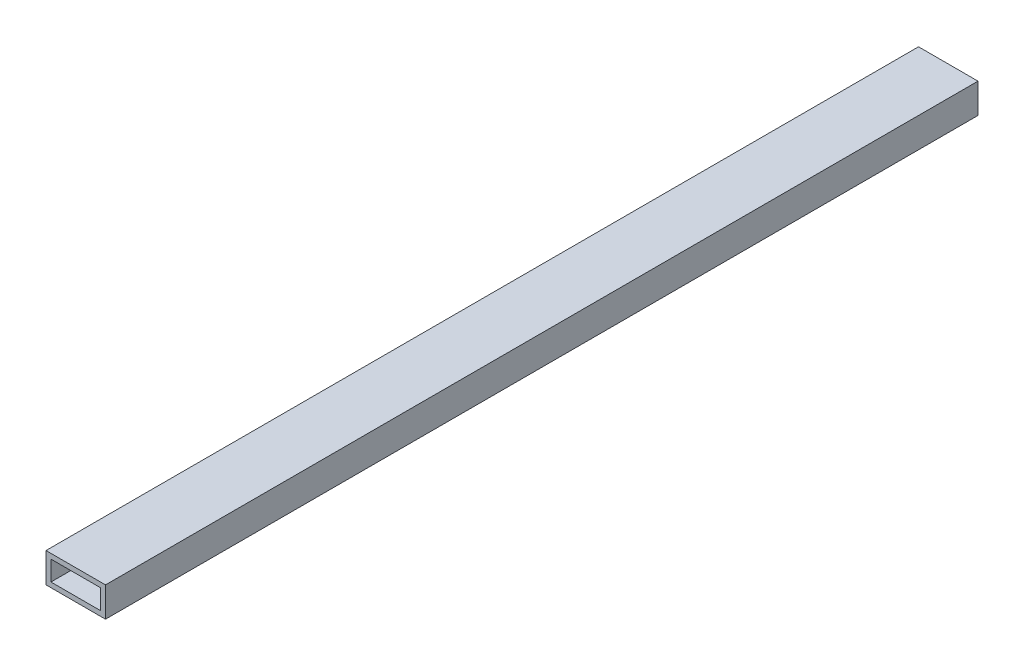
ISO-10303-21;
HEADER;
FILE_DESCRIPTION(('STEP AP214'),'2;1');
FILE_NAME('part.step','',(''),(''),'','','');
FILE_SCHEMA(('AUTOMOTIVE_DESIGN { 1 0 10303 214 1 1 1 1 }'));
ENDSEC;
DATA;
#1=APPLICATION_CONTEXT('core data for automotive mechanical design processes');
#2=APPLICATION_PROTOCOL_DEFINITION('international standard','automotive_design',2000,#1);
#3=PRODUCT_CONTEXT('',#1,'mechanical');
#4=PRODUCT('Part','Part','',(#3));
#5=PRODUCT_RELATED_PRODUCT_CATEGORY('part','',(#4));
#6=PRODUCT_DEFINITION_FORMATION('','',#4);
#7=PRODUCT_DEFINITION_CONTEXT('part definition',#1,'design');
#8=PRODUCT_DEFINITION('design','',#6,#7);
#9=PRODUCT_DEFINITION_SHAPE('','',#8);
#10=(LENGTH_UNIT() NAMED_UNIT(*) SI_UNIT(.MILLI.,.METRE.));
#11=(NAMED_UNIT(*) PLANE_ANGLE_UNIT() SI_UNIT($,.RADIAN.));
#12=(NAMED_UNIT(*) SI_UNIT($,.STERADIAN.) SOLID_ANGLE_UNIT());
#13=UNCERTAINTY_MEASURE_WITH_UNIT(LENGTH_MEASURE(1.E-05),#10,'distance_accuracy_value','');
#14=(GEOMETRIC_REPRESENTATION_CONTEXT(3) GLOBAL_UNCERTAINTY_ASSIGNED_CONTEXT((#13)) GLOBAL_UNIT_ASSIGNED_CONTEXT((#10,
#11,#12)) REPRESENTATION_CONTEXT('',''));
#15=CARTESIAN_POINT('',(0.,0.,0.));
#16=DIRECTION('',(0.,0.,1.));
#17=DIRECTION('',(1.,0.,0.));
#18=AXIS2_PLACEMENT_3D('',#15,#16,#17);
#19=CARTESIAN_POINT('',(0.,0.,558.8));
#20=DIRECTION('',(0.,0.,1.));
#21=DIRECTION('',(1.,0.,0.));
#22=AXIS2_PLACEMENT_3D('',#19,#20,#21);
#23=PLANE('',#22);
#24=DIRECTION('',(0.,-1.,0.));
#25=VECTOR('',#24,1.);
#26=CARTESIAN_POINT('',(0.,0.,558.8));
#27=LINE('',#26,#25);
#28=CARTESIAN_POINT('',(0.,19.05,558.8));
#29=VERTEX_POINT('',#28);
#30=CARTESIAN_POINT('',(0.,0.,558.8));
#31=VERTEX_POINT('',#30);
#32=EDGE_CURVE('E158',#29,#31,#27,.T.);
#33=ORIENTED_EDGE('',*,*,#32,.T.);
#34=DIRECTION('',(1.,0.,0.));
#35=VECTOR('',#34,1.);
#36=CARTESIAN_POINT('',(0.,0.,558.8));
#37=LINE('',#36,#35);
#38=CARTESIAN_POINT('',(38.1,0.,558.8));
#39=VERTEX_POINT('',#38);
#40=EDGE_CURVE('E161',#31,#39,#37,.T.);
#41=ORIENTED_EDGE('',*,*,#40,.T.);
#42=DIRECTION('',(0.,1.,0.));
#43=VECTOR('',#42,1.);
#44=CARTESIAN_POINT('',(38.1,0.,558.8));
#45=LINE('',#44,#43);
#46=CARTESIAN_POINT('',(38.1,19.05,558.8));
#47=VERTEX_POINT('',#46);
#48=EDGE_CURVE('E164',#39,#47,#45,.T.);
#49=ORIENTED_EDGE('',*,*,#48,.T.);
#50=DIRECTION('',(-1.,0.,0.));
#51=VECTOR('',#50,1.);
#52=CARTESIAN_POINT('',(0.,19.05,558.8));
#53=LINE('',#52,#51);
#54=EDGE_CURVE('E166',#47,#29,#53,.T.);
#55=ORIENTED_EDGE('',*,*,#54,.T.);
#56=EDGE_LOOP('',(#33,#41,#49,#55));
#57=FACE_BOUND('',#56,.T.);
#58=DIRECTION('',(1.,0.,0.));
#59=VECTOR('',#58,1.);
#60=CARTESIAN_POINT('',(0.,3.175,558.8));
#61=LINE('',#60,#59);
#62=CARTESIAN_POINT('',(3.175,3.175,558.8));
#63=VERTEX_POINT('',#62);
#64=CARTESIAN_POINT('',(34.925,3.175,558.8));
#65=VERTEX_POINT('',#64);
#66=EDGE_CURVE('E130',#63,#65,#61,.T.);
#67=ORIENTED_EDGE('',*,*,#66,.F.);
#68=DIRECTION('',(0.,-1.,0.));
#69=VECTOR('',#68,1.);
#70=CARTESIAN_POINT('',(3.175,0.,558.8));
#71=LINE('',#70,#69);
#72=CARTESIAN_POINT('',(3.175,15.875,558.8));
#73=VERTEX_POINT('',#72);
#74=EDGE_CURVE('E122',#73,#63,#71,.T.);
#75=ORIENTED_EDGE('',*,*,#74,.F.);
#76=DIRECTION('',(-1.,0.,0.));
#77=VECTOR('',#76,1.);
#78=CARTESIAN_POINT('',(0.,15.875,558.8));
#79=LINE('',#78,#77);
#80=CARTESIAN_POINT('',(34.925,15.875,558.8));
#81=VERTEX_POINT('',#80);
#82=EDGE_CURVE('E144',#81,#73,#79,.T.);
#83=ORIENTED_EDGE('',*,*,#82,.F.);
#84=DIRECTION('',(0.,1.,0.));
#85=VECTOR('',#84,1.);
#86=CARTESIAN_POINT('',(34.925,0.,558.8));
#87=LINE('',#86,#85);
#88=EDGE_CURVE('E142',#65,#81,#87,.T.);
#89=ORIENTED_EDGE('',*,*,#88,.F.);
#90=EDGE_LOOP('',(#67,#75,#83,#89));
#91=FACE_BOUND('',#90,.T.);
#92=ADVANCED_FACE('F57',(#57,#91),#23,.T.);
#93=CARTESIAN_POINT('',(0.,0.,0.));
#94=DIRECTION('',(0.,0.,1.));
#95=DIRECTION('',(1.,0.,0.));
#96=AXIS2_PLACEMENT_3D('',#93,#94,#95);
#97=PLANE('',#96);
#98=DIRECTION('',(0.,-1.,0.));
#99=VECTOR('',#98,1.);
#100=CARTESIAN_POINT('',(0.,0.,0.));
#101=LINE('',#100,#99);
#102=CARTESIAN_POINT('',(0.,19.05,0.));
#103=VERTEX_POINT('',#102);
#104=CARTESIAN_POINT('',(0.,0.,0.));
#105=VERTEX_POINT('',#104);
#106=EDGE_CURVE('E138',#103,#105,#101,.T.);
#107=ORIENTED_EDGE('',*,*,#106,.F.);
#108=DIRECTION('',(-1.,0.,0.));
#109=VECTOR('',#108,1.);
#110=CARTESIAN_POINT('',(0.,19.05,0.));
#111=LINE('',#110,#109);
#112=CARTESIAN_POINT('',(38.1,19.05,0.));
#113=VERTEX_POINT('',#112);
#114=EDGE_CURVE('E162',#113,#103,#111,.T.);
#115=ORIENTED_EDGE('',*,*,#114,.F.);
#116=DIRECTION('',(0.,1.,0.));
#117=VECTOR('',#116,1.);
#118=CARTESIAN_POINT('',(38.1,0.,0.));
#119=LINE('',#118,#117);
#120=CARTESIAN_POINT('',(38.1,0.,0.));
#121=VERTEX_POINT('',#120);
#122=EDGE_CURVE('E173',#121,#113,#119,.T.);
#123=ORIENTED_EDGE('',*,*,#122,.F.);
#124=DIRECTION('',(1.,0.,0.));
#125=VECTOR('',#124,1.);
#126=CARTESIAN_POINT('',(0.,0.,0.));
#127=LINE('',#126,#125);
#128=EDGE_CURVE('E171',#105,#121,#127,.T.);
#129=ORIENTED_EDGE('',*,*,#128,.F.);
#130=EDGE_LOOP('',(#107,#115,#123,#129));
#131=FACE_BOUND('',#130,.T.);
#132=DIRECTION('',(0.,-1.,0.));
#133=VECTOR('',#132,1.);
#134=CARTESIAN_POINT('',(3.175,0.,0.));
#135=LINE('',#134,#133);
#136=CARTESIAN_POINT('',(3.175,15.875,0.));
#137=VERTEX_POINT('',#136);
#138=CARTESIAN_POINT('',(3.175,3.175,0.));
#139=VERTEX_POINT('',#138);
#140=EDGE_CURVE('E80',#137,#139,#135,.T.);
#141=ORIENTED_EDGE('',*,*,#140,.T.);
#142=DIRECTION('',(1.,0.,0.));
#143=VECTOR('',#142,1.);
#144=CARTESIAN_POINT('',(0.,3.175,0.));
#145=LINE('',#144,#143);
#146=CARTESIAN_POINT('',(34.925,3.175,0.));
#147=VERTEX_POINT('',#146);
#148=EDGE_CURVE('E137',#139,#147,#145,.T.);
#149=ORIENTED_EDGE('',*,*,#148,.T.);
#150=DIRECTION('',(0.,1.,0.));
#151=VECTOR('',#150,1.);
#152=CARTESIAN_POINT('',(34.925,0.,0.));
#153=LINE('',#152,#151);
#154=CARTESIAN_POINT('',(34.925,15.875,0.));
#155=VERTEX_POINT('',#154);
#156=EDGE_CURVE('E150',#147,#155,#153,.T.);
#157=ORIENTED_EDGE('',*,*,#156,.T.);
#158=DIRECTION('',(-1.,0.,0.));
#159=VECTOR('',#158,1.);
#160=CARTESIAN_POINT('',(0.,15.875,0.));
#161=LINE('',#160,#159);
#162=EDGE_CURVE('E131',#155,#137,#161,.T.);
#163=ORIENTED_EDGE('',*,*,#162,.T.);
#164=EDGE_LOOP('',(#141,#149,#157,#163));
#165=FACE_BOUND('',#164,.T.);
#166=ADVANCED_FACE('F191',(#131,#165),#97,.F.);
#167=CARTESIAN_POINT('',(0.,0.,558.8));
#168=DIRECTION('',(1.,0.,0.));
#169=DIRECTION('',(0.,0.,-1.));
#170=AXIS2_PLACEMENT_3D('',#167,#168,#169);
#171=PLANE('',#170);
#172=ORIENTED_EDGE('',*,*,#106,.T.);
#173=DIRECTION('',(0.,0.,-1.));
#174=VECTOR('',#173,1.);
#175=CARTESIAN_POINT('',(0.,0.,558.8));
#176=LINE('',#175,#174);
#177=EDGE_CURVE('E12',#31,#105,#176,.T.);
#178=ORIENTED_EDGE('',*,*,#177,.F.);
#179=ORIENTED_EDGE('',*,*,#32,.F.);
#180=DIRECTION('',(0.,0.,-1.));
#181=VECTOR('',#180,1.);
#182=CARTESIAN_POINT('',(0.,19.05,558.8));
#183=LINE('',#182,#181);
#184=EDGE_CURVE('E168',#29,#103,#183,.T.);
#185=ORIENTED_EDGE('',*,*,#184,.T.);
#186=EDGE_LOOP('',(#172,#178,#179,#185));
#187=FACE_BOUND('',#186,.T.);
#188=ADVANCED_FACE('F59',(#187),#171,.F.);
#189=CARTESIAN_POINT('',(0.,0.,558.8));
#190=DIRECTION('',(0.,1.,0.));
#191=DIRECTION('',(0.,0.,1.));
#192=AXIS2_PLACEMENT_3D('',#189,#190,#191);
#193=PLANE('',#192);
#194=ORIENTED_EDGE('',*,*,#128,.T.);
#195=DIRECTION('',(0.,0.,-1.));
#196=VECTOR('',#195,1.);
#197=CARTESIAN_POINT('',(38.1,0.,558.8));
#198=LINE('',#197,#196);
#199=EDGE_CURVE('E65',#39,#121,#198,.T.);
#200=ORIENTED_EDGE('',*,*,#199,.F.);
#201=ORIENTED_EDGE('',*,*,#40,.F.);
#202=ORIENTED_EDGE('',*,*,#177,.T.);
#203=EDGE_LOOP('',(#194,#200,#201,#202));
#204=FACE_BOUND('',#203,.T.);
#205=ADVANCED_FACE('F201',(#204),#193,.F.);
#206=CARTESIAN_POINT('',(38.1,0.,558.8));
#207=DIRECTION('',(-1.,0.,0.));
#208=DIRECTION('',(0.,0.,1.));
#209=AXIS2_PLACEMENT_3D('',#206,#207,#208);
#210=PLANE('',#209);
#211=ORIENTED_EDGE('',*,*,#122,.T.);
#212=DIRECTION('',(0.,0.,-1.));
#213=VECTOR('',#212,1.);
#214=CARTESIAN_POINT('',(38.1,19.05,558.8));
#215=LINE('',#214,#213);
#216=EDGE_CURVE('E178',#47,#113,#215,.T.);
#217=ORIENTED_EDGE('',*,*,#216,.F.);
#218=ORIENTED_EDGE('',*,*,#48,.F.);
#219=ORIENTED_EDGE('',*,*,#199,.T.);
#220=EDGE_LOOP('',(#211,#217,#218,#219));
#221=FACE_BOUND('',#220,.T.);
#222=ADVANCED_FACE('F185',(#221),#210,.F.);
#223=CARTESIAN_POINT('',(0.,19.05,558.8));
#224=DIRECTION('',(0.,-1.,0.));
#225=DIRECTION('',(0.,0.,-1.));
#226=AXIS2_PLACEMENT_3D('',#223,#224,#225);
#227=PLANE('',#226);
#228=ORIENTED_EDGE('',*,*,#114,.T.);
#229=ORIENTED_EDGE('',*,*,#184,.F.);
#230=ORIENTED_EDGE('',*,*,#54,.F.);
#231=ORIENTED_EDGE('',*,*,#216,.T.);
#232=EDGE_LOOP('',(#228,#229,#230,#231));
#233=FACE_BOUND('',#232,.T.);
#234=ADVANCED_FACE('F195',(#233),#227,.F.);
#235=CARTESIAN_POINT('',(3.175,0.,558.8));
#236=DIRECTION('',(1.,0.,0.));
#237=DIRECTION('',(0.,0.,-1.));
#238=AXIS2_PLACEMENT_3D('',#235,#236,#237);
#239=PLANE('',#238);
#240=ORIENTED_EDGE('',*,*,#140,.F.);
#241=DIRECTION('',(0.,0.,-1.));
#242=VECTOR('',#241,1.);
#243=CARTESIAN_POINT('',(3.175,15.875,558.8));
#244=LINE('',#243,#242);
#245=EDGE_CURVE('E126',#73,#137,#244,.T.);
#246=ORIENTED_EDGE('',*,*,#245,.F.);
#247=ORIENTED_EDGE('',*,*,#74,.T.);
#248=DIRECTION('',(0.,0.,-1.));
#249=VECTOR('',#248,1.);
#250=CARTESIAN_POINT('',(3.175,3.175,558.8));
#251=LINE('',#250,#249);
#252=EDGE_CURVE('E125',#63,#139,#251,.T.);
#253=ORIENTED_EDGE('',*,*,#252,.T.);
#254=EDGE_LOOP('',(#240,#246,#247,#253));
#255=FACE_BOUND('',#254,.T.);
#256=ADVANCED_FACE('F124',(#255),#239,.T.);
#257=CARTESIAN_POINT('',(0.,3.175,558.8));
#258=DIRECTION('',(0.,1.,0.));
#259=DIRECTION('',(0.,0.,1.));
#260=AXIS2_PLACEMENT_3D('',#257,#258,#259);
#261=PLANE('',#260);
#262=ORIENTED_EDGE('',*,*,#148,.F.);
#263=ORIENTED_EDGE('',*,*,#252,.F.);
#264=ORIENTED_EDGE('',*,*,#66,.T.);
#265=DIRECTION('',(0.,0.,-1.));
#266=VECTOR('',#265,1.);
#267=CARTESIAN_POINT('',(34.925,3.175,558.8));
#268=LINE('',#267,#266);
#269=EDGE_CURVE('E139',#65,#147,#268,.T.);
#270=ORIENTED_EDGE('',*,*,#269,.T.);
#271=EDGE_LOOP('',(#262,#263,#264,#270));
#272=FACE_BOUND('',#271,.T.);
#273=ADVANCED_FACE('F134',(#272),#261,.T.);
#274=CARTESIAN_POINT('',(34.925,0.,558.8));
#275=DIRECTION('',(-1.,0.,0.));
#276=DIRECTION('',(0.,0.,1.));
#277=AXIS2_PLACEMENT_3D('',#274,#275,#276);
#278=PLANE('',#277);
#279=ORIENTED_EDGE('',*,*,#156,.F.);
#280=ORIENTED_EDGE('',*,*,#269,.F.);
#281=ORIENTED_EDGE('',*,*,#88,.T.);
#282=DIRECTION('',(0.,0.,-1.));
#283=VECTOR('',#282,1.);
#284=CARTESIAN_POINT('',(34.925,15.875,558.8));
#285=LINE('',#284,#283);
#286=EDGE_CURVE('E72',#81,#155,#285,.T.);
#287=ORIENTED_EDGE('',*,*,#286,.T.);
#288=EDGE_LOOP('',(#279,#280,#281,#287));
#289=FACE_BOUND('',#288,.T.);
#290=ADVANCED_FACE('F224',(#289),#278,.T.);
#291=CARTESIAN_POINT('',(0.,15.875,558.8));
#292=DIRECTION('',(0.,-1.,0.));
#293=DIRECTION('',(0.,0.,-1.));
#294=AXIS2_PLACEMENT_3D('',#291,#292,#293);
#295=PLANE('',#294);
#296=ORIENTED_EDGE('',*,*,#162,.F.);
#297=ORIENTED_EDGE('',*,*,#286,.F.);
#298=ORIENTED_EDGE('',*,*,#82,.T.);
#299=ORIENTED_EDGE('',*,*,#245,.T.);
#300=EDGE_LOOP('',(#296,#297,#298,#299));
#301=FACE_BOUND('',#300,.T.);
#302=ADVANCED_FACE('F228',(#301),#295,.T.);
#303=CLOSED_SHELL('',(#92,#166,#188,#205,#222,#234,#256,#273,#290,#302));
#304=MANIFOLD_SOLID_BREP('B2',#303);
#305=ADVANCED_BREP_SHAPE_REPRESENTATION('',(#18,#304),#14);
#306=SHAPE_DEFINITION_REPRESENTATION(#9,#305);
ENDSEC;
END-ISO-10303-21;
